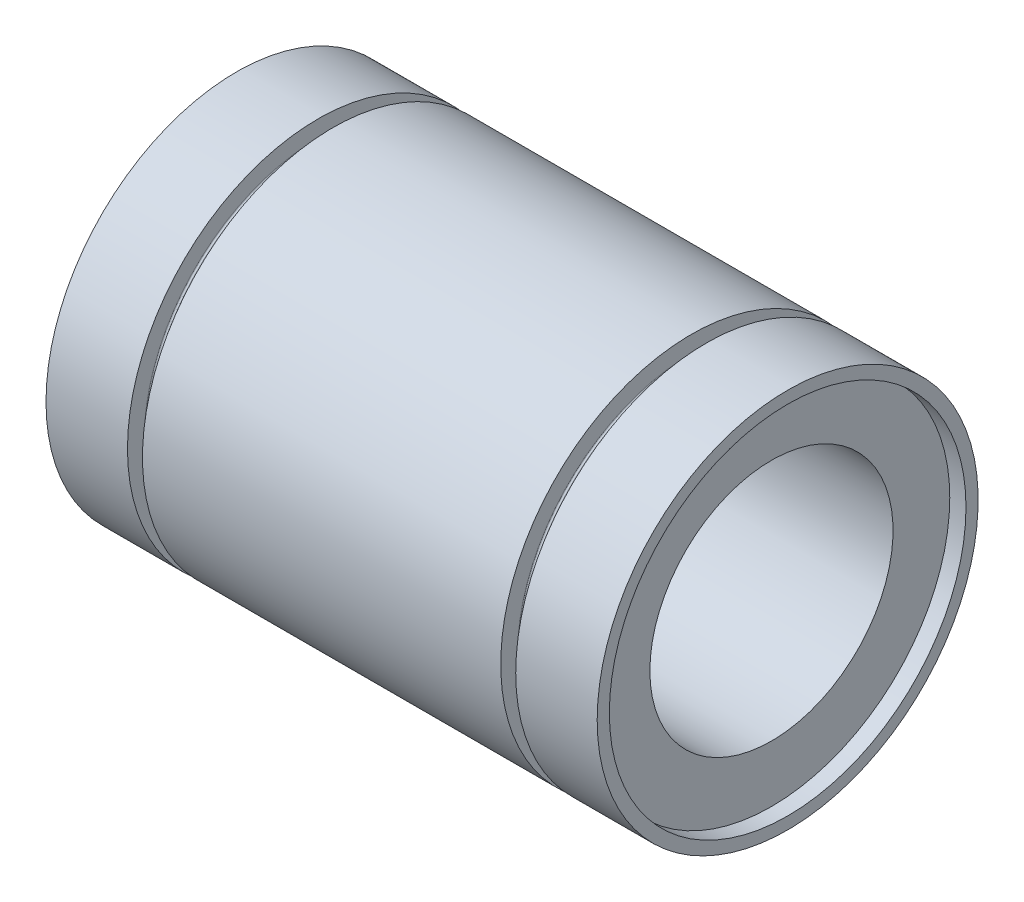
ISO-10303-21;
HEADER;
FILE_DESCRIPTION(('STEP AP214'),'2;1');
FILE_NAME('part.step','',(''),(''),'','','');
FILE_SCHEMA(('AUTOMOTIVE_DESIGN { 1 0 10303 214 1 1 1 1 }'));
ENDSEC;
DATA;
#1=APPLICATION_CONTEXT('core data for automotive mechanical design processes');
#2=APPLICATION_PROTOCOL_DEFINITION('international standard','automotive_design',2000,#1);
#3=PRODUCT_CONTEXT('',#1,'mechanical');
#4=PRODUCT('Part','Part','',(#3));
#5=PRODUCT_RELATED_PRODUCT_CATEGORY('part','',(#4));
#6=PRODUCT_DEFINITION_FORMATION('','',#4);
#7=PRODUCT_DEFINITION_CONTEXT('part definition',#1,'design');
#8=PRODUCT_DEFINITION('design','',#6,#7);
#9=PRODUCT_DEFINITION_SHAPE('','',#8);
#10=(LENGTH_UNIT() NAMED_UNIT(*) SI_UNIT(.MILLI.,.METRE.));
#11=(NAMED_UNIT(*) PLANE_ANGLE_UNIT() SI_UNIT($,.RADIAN.));
#12=(NAMED_UNIT(*) SI_UNIT($,.STERADIAN.) SOLID_ANGLE_UNIT());
#13=UNCERTAINTY_MEASURE_WITH_UNIT(LENGTH_MEASURE(1.E-05),#10,'distance_accuracy_value','');
#14=(GEOMETRIC_REPRESENTATION_CONTEXT(3) GLOBAL_UNCERTAINTY_ASSIGNED_CONTEXT((#13)) GLOBAL_UNIT_ASSIGNED_CONTEXT((#10,
#11,#12)) REPRESENTATION_CONTEXT('',''));
#15=CARTESIAN_POINT('',(0.,0.,0.));
#16=DIRECTION('',(0.,0.,1.));
#17=DIRECTION('',(1.,0.,0.));
#18=AXIS2_PLACEMENT_3D('',#15,#16,#17);
#19=CARTESIAN_POINT('',(0.,0.,0.));
#20=DIRECTION('',(-1.,0.,0.));
#21=DIRECTION('',(0.,0.,1.));
#22=AXIS2_PLACEMENT_3D('',#19,#20,#21);
#23=CYLINDRICAL_SURFACE('',#22,23.5);
#24=CARTESIAN_POINT('',(34.,0.,0.));
#25=DIRECTION('',(-1.,0.,0.));
#26=DIRECTION('',(0.,0.,1.));
#27=AXIS2_PLACEMENT_3D('',#24,#25,#26);
#28=CIRCLE('',#27,23.5);
#29=CARTESIAN_POINT('',(34.,0.,23.5));
#30=VERTEX_POINT('',#29);
#31=EDGE_CURVE('E44',#30,#30,#28,.T.);
#32=ORIENTED_EDGE('',*,*,#31,.T.);
#33=EDGE_LOOP('',(#32));
#34=FACE_BOUND('',#33,.T.);
#35=CARTESIAN_POINT('',(23.95,0.,0.));
#36=DIRECTION('',(-1.,0.,0.));
#37=DIRECTION('',(0.,0.,1.));
#38=AXIS2_PLACEMENT_3D('',#35,#36,#37);
#39=CIRCLE('',#38,23.5);
#40=CARTESIAN_POINT('',(23.95,0.,23.5));
#41=VERTEX_POINT('',#40);
#42=EDGE_CURVE('E40',#41,#41,#39,.F.);
#43=ORIENTED_EDGE('',*,*,#42,.T.);
#44=EDGE_LOOP('',(#43));
#45=FACE_BOUND('',#44,.T.);
#46=ADVANCED_FACE('F36',(#34,#45),#23,.T.);
#47=CARTESIAN_POINT('',(22.1,0.,0.));
#48=DIRECTION('',(1.,0.,0.));
#49=DIRECTION('',(0.,0.,-1.));
#50=AXIS2_PLACEMENT_3D('',#47,#48,#49);
#51=CIRCLE('',#50,23.5);
#52=CARTESIAN_POINT('',(22.1,0.,-23.5));
#53=VERTEX_POINT('',#52);
#54=EDGE_CURVE('E52',#53,#53,#51,.F.);
#55=ORIENTED_EDGE('',*,*,#54,.T.);
#56=EDGE_LOOP('',(#55));
#57=FACE_BOUND('',#56,.T.);
#58=CARTESIAN_POINT('',(-22.1,0.,0.));
#59=DIRECTION('',(1.,0.,0.));
#60=DIRECTION('',(0.,0.,-1.));
#61=AXIS2_PLACEMENT_3D('',#58,#59,#60);
#62=CIRCLE('',#61,23.5);
#63=CARTESIAN_POINT('',(-22.1,0.,-23.5));
#64=VERTEX_POINT('',#63);
#65=EDGE_CURVE('E98',#64,#64,#62,.F.);
#66=ORIENTED_EDGE('',*,*,#65,.F.);
#67=EDGE_LOOP('',(#66));
#68=FACE_BOUND('',#67,.T.);
#69=ADVANCED_FACE('F125',(#57,#68),#23,.T.);
#70=CARTESIAN_POINT('',(0.,0.,0.));
#71=DIRECTION('',(-1.,0.,0.));
#72=DIRECTION('',(0.,0.,1.));
#73=AXIS2_PLACEMENT_3D('',#70,#71,#72);
#74=CYLINDRICAL_SURFACE('',#73,22.);
#75=CARTESIAN_POINT('',(34.,0.,0.));
#76=DIRECTION('',(-1.,0.,0.));
#77=DIRECTION('',(0.,0.,1.));
#78=AXIS2_PLACEMENT_3D('',#75,#76,#77);
#79=CIRCLE('',#78,22.);
#80=CARTESIAN_POINT('',(34.,0.,22.));
#81=VERTEX_POINT('',#80);
#82=EDGE_CURVE('E10',#81,#81,#79,.T.);
#83=ORIENTED_EDGE('',*,*,#82,.F.);
#84=EDGE_LOOP('',(#83));
#85=FACE_BOUND('',#84,.T.);
#86=CARTESIAN_POINT('',(32.,0.,0.));
#87=DIRECTION('',(-1.,0.,0.));
#88=DIRECTION('',(0.,0.,1.));
#89=AXIS2_PLACEMENT_3D('',#86,#87,#88);
#90=CIRCLE('',#89,22.);
#91=CARTESIAN_POINT('',(32.,0.,22.));
#92=VERTEX_POINT('',#91);
#93=EDGE_CURVE('E58',#92,#92,#90,.T.);
#94=ORIENTED_EDGE('',*,*,#93,.T.);
#95=EDGE_LOOP('',(#94));
#96=FACE_BOUND('',#95,.T.);
#97=ADVANCED_FACE('F38',(#85,#96),#74,.F.);
#98=CARTESIAN_POINT('',(34.,0.,0.));
#99=DIRECTION('',(-1.,0.,0.));
#100=DIRECTION('',(0.,0.,1.));
#101=AXIS2_PLACEMENT_3D('',#98,#99,#100);
#102=PLANE('',#101);
#103=ORIENTED_EDGE('',*,*,#31,.F.);
#104=EDGE_LOOP('',(#103));
#105=FACE_BOUND('',#104,.T.);
#106=ORIENTED_EDGE('',*,*,#82,.T.);
#107=EDGE_LOOP('',(#106));
#108=FACE_BOUND('',#107,.T.);
#109=ADVANCED_FACE('F78',(#105,#108),#102,.F.);
#110=CARTESIAN_POINT('',(0.,0.,0.));
#111=DIRECTION('',(-1.,0.,0.));
#112=DIRECTION('',(0.,0.,1.));
#113=AXIS2_PLACEMENT_3D('',#110,#111,#112);
#114=CYLINDRICAL_SURFACE('',#113,15.);
#115=CARTESIAN_POINT('',(32.,0.,0.));
#116=DIRECTION('',(-1.,0.,0.));
#117=DIRECTION('',(0.,0.,1.));
#118=AXIS2_PLACEMENT_3D('',#115,#116,#117);
#119=CIRCLE('',#118,15.);
#120=CARTESIAN_POINT('',(32.,0.,15.));
#121=VERTEX_POINT('',#120);
#122=EDGE_CURVE('E49',#121,#121,#119,.T.);
#123=ORIENTED_EDGE('',*,*,#122,.F.);
#124=EDGE_LOOP('',(#123));
#125=FACE_BOUND('',#124,.T.);
#126=CARTESIAN_POINT('',(-32.,0.,0.));
#127=DIRECTION('',(-1.,0.,0.));
#128=DIRECTION('',(0.,0.,1.));
#129=AXIS2_PLACEMENT_3D('',#126,#127,#128);
#130=CIRCLE('',#129,15.);
#131=CARTESIAN_POINT('',(-32.,0.,15.));
#132=VERTEX_POINT('',#131);
#133=EDGE_CURVE('E82',#132,#132,#130,.T.);
#134=ORIENTED_EDGE('',*,*,#133,.T.);
#135=EDGE_LOOP('',(#134));
#136=FACE_BOUND('',#135,.T.);
#137=ADVANCED_FACE('F75',(#125,#136),#114,.F.);
#138=CARTESIAN_POINT('',(32.,0.,0.));
#139=DIRECTION('',(-1.,0.,0.));
#140=DIRECTION('',(0.,0.,1.));
#141=AXIS2_PLACEMENT_3D('',#138,#139,#140);
#142=PLANE('',#141);
#143=ORIENTED_EDGE('',*,*,#93,.F.);
#144=EDGE_LOOP('',(#143));
#145=FACE_BOUND('',#144,.T.);
#146=ORIENTED_EDGE('',*,*,#122,.T.);
#147=EDGE_LOOP('',(#146));
#148=FACE_BOUND('',#147,.T.);
#149=ADVANCED_FACE('F73',(#145,#148),#142,.F.);
#150=CARTESIAN_POINT('',(23.95,0.,21.435));
#151=DIRECTION('',(-1.,0.,0.));
#152=DIRECTION('',(0.,0.,1.));
#153=AXIS2_PLACEMENT_3D('',#150,#151,#152);
#154=PLANE('',#153);
#155=ORIENTED_EDGE('',*,*,#42,.F.);
#156=EDGE_LOOP('',(#155));
#157=FACE_BOUND('',#156,.T.);
#158=CARTESIAN_POINT('',(23.95,0.,0.));
#159=DIRECTION('',(-1.,0.,0.));
#160=DIRECTION('',(0.,0.,1.));
#161=AXIS2_PLACEMENT_3D('',#158,#159,#160);
#162=CIRCLE('',#161,21.435);
#163=CARTESIAN_POINT('',(23.95,0.,21.435));
#164=VERTEX_POINT('',#163);
#165=EDGE_CURVE('E54',#164,#164,#162,.T.);
#166=ORIENTED_EDGE('',*,*,#165,.F.);
#167=EDGE_LOOP('',(#166));
#168=FACE_BOUND('',#167,.T.);
#169=ADVANCED_FACE('F122',(#157,#168),#154,.T.);
#170=CARTESIAN_POINT('',(23.765,0.,0.));
#171=DIRECTION('',(-1.,0.,0.));
#172=DIRECTION('',(0.,0.,1.));
#173=AXIS2_PLACEMENT_3D('',#170,#171,#172);
#174=TOROIDAL_SURFACE('',#173,21.435,0.185000000000003);
#175=ORIENTED_EDGE('',*,*,#165,.T.);
#176=EDGE_LOOP('',(#175));
#177=FACE_BOUND('',#176,.T.);
#178=CARTESIAN_POINT('',(23.765,0.,0.));
#179=DIRECTION('',(-1.,0.,0.));
#180=DIRECTION('',(0.,0.,1.));
#181=AXIS2_PLACEMENT_3D('',#178,#179,#180);
#182=CIRCLE('',#181,21.25);
#183=CARTESIAN_POINT('',(23.765,0.,21.25));
#184=VERTEX_POINT('',#183);
#185=EDGE_CURVE('E60',#184,#184,#182,.T.);
#186=ORIENTED_EDGE('',*,*,#185,.F.);
#187=EDGE_LOOP('',(#186));
#188=FACE_BOUND('',#187,.T.);
#189=ADVANCED_FACE('F113',(#177,#188),#174,.F.);
#190=CARTESIAN_POINT('',(50.,0.,0.));
#191=DIRECTION('',(-1.,0.,0.));
#192=DIRECTION('',(0.,0.,1.));
#193=AXIS2_PLACEMENT_3D('',#190,#191,#192);
#194=CYLINDRICAL_SURFACE('',#193,21.25);
#195=ORIENTED_EDGE('',*,*,#185,.T.);
#196=EDGE_LOOP('',(#195));
#197=FACE_BOUND('',#196,.T.);
#198=CARTESIAN_POINT('',(22.285,0.,0.));
#199=DIRECTION('',(-1.,0.,0.));
#200=DIRECTION('',(0.,0.,1.));
#201=AXIS2_PLACEMENT_3D('',#198,#199,#200);
#202=CIRCLE('',#201,21.25);
#203=CARTESIAN_POINT('',(22.285,0.,21.25));
#204=VERTEX_POINT('',#203);
#205=EDGE_CURVE('E65',#204,#204,#202,.T.);
#206=ORIENTED_EDGE('',*,*,#205,.F.);
#207=EDGE_LOOP('',(#206));
#208=FACE_BOUND('',#207,.T.);
#209=ADVANCED_FACE('F111',(#197,#208),#194,.T.);
#210=CARTESIAN_POINT('',(22.285,0.,0.));
#211=DIRECTION('',(-1.,0.,0.));
#212=DIRECTION('',(0.,0.,1.));
#213=AXIS2_PLACEMENT_3D('',#210,#211,#212);
#214=TOROIDAL_SURFACE('',#213,21.435,0.184999999999999);
#215=ORIENTED_EDGE('',*,*,#205,.T.);
#216=EDGE_LOOP('',(#215));
#217=FACE_BOUND('',#216,.T.);
#218=CARTESIAN_POINT('',(22.1,0.,0.));
#219=DIRECTION('',(-1.,0.,0.));
#220=DIRECTION('',(0.,0.,1.));
#221=AXIS2_PLACEMENT_3D('',#218,#219,#220);
#222=CIRCLE('',#221,21.435);
#223=CARTESIAN_POINT('',(22.1,0.,21.435));
#224=VERTEX_POINT('',#223);
#225=EDGE_CURVE('E97',#224,#224,#222,.T.);
#226=ORIENTED_EDGE('',*,*,#225,.F.);
#227=EDGE_LOOP('',(#226));
#228=FACE_BOUND('',#227,.T.);
#229=ADVANCED_FACE('F108',(#217,#228),#214,.F.);
#230=CARTESIAN_POINT('',(22.1,0.,28.2));
#231=DIRECTION('',(1.,0.,0.));
#232=DIRECTION('',(0.,0.,-1.));
#233=AXIS2_PLACEMENT_3D('',#230,#231,#232);
#234=PLANE('',#233);
#235=ORIENTED_EDGE('',*,*,#54,.F.);
#236=EDGE_LOOP('',(#235));
#237=FACE_BOUND('',#236,.T.);
#238=ORIENTED_EDGE('',*,*,#225,.T.);
#239=EDGE_LOOP('',(#238));
#240=FACE_BOUND('',#239,.T.);
#241=ADVANCED_FACE('F120',(#237,#240),#234,.T.);
#242=CARTESIAN_POINT('',(0.,0.,0.));
#243=DIRECTION('',(1.,0.,0.));
#244=DIRECTION('',(0.,0.,1.));
#245=AXIS2_PLACEMENT_3D('',#242,#243,#244);
#246=CYLINDRICAL_SURFACE('',#245,23.5);
#247=CARTESIAN_POINT('',(-34.,0.,0.));
#248=DIRECTION('',(-1.,0.,0.));
#249=DIRECTION('',(0.,0.,1.));
#250=AXIS2_PLACEMENT_3D('',#247,#248,#249);
#251=CIRCLE('',#250,23.5);
#252=CARTESIAN_POINT('',(-34.,0.,23.5));
#253=VERTEX_POINT('',#252);
#254=EDGE_CURVE('E84',#253,#253,#251,.T.);
#255=ORIENTED_EDGE('',*,*,#254,.F.);
#256=EDGE_LOOP('',(#255));
#257=FACE_BOUND('',#256,.T.);
#258=CARTESIAN_POINT('',(-23.95,0.,0.));
#259=DIRECTION('',(-1.,0.,0.));
#260=DIRECTION('',(0.,0.,1.));
#261=AXIS2_PLACEMENT_3D('',#258,#259,#260);
#262=CIRCLE('',#261,23.5);
#263=CARTESIAN_POINT('',(-23.95,0.,23.5));
#264=VERTEX_POINT('',#263);
#265=EDGE_CURVE('E91',#264,#264,#262,.F.);
#266=ORIENTED_EDGE('',*,*,#265,.F.);
#267=EDGE_LOOP('',(#266));
#268=FACE_BOUND('',#267,.T.);
#269=ADVANCED_FACE('F196',(#257,#268),#246,.T.);
#270=CARTESIAN_POINT('',(0.,0.,0.));
#271=DIRECTION('',(1.,0.,0.));
#272=DIRECTION('',(0.,0.,1.));
#273=AXIS2_PLACEMENT_3D('',#270,#271,#272);
#274=CYLINDRICAL_SURFACE('',#273,22.);
#275=CARTESIAN_POINT('',(-34.,0.,0.));
#276=DIRECTION('',(-1.,0.,0.));
#277=DIRECTION('',(0.,0.,1.));
#278=AXIS2_PLACEMENT_3D('',#275,#276,#277);
#279=CIRCLE('',#278,22.);
#280=CARTESIAN_POINT('',(-34.,0.,22.));
#281=VERTEX_POINT('',#280);
#282=EDGE_CURVE('E88',#281,#281,#279,.T.);
#283=ORIENTED_EDGE('',*,*,#282,.T.);
#284=EDGE_LOOP('',(#283));
#285=FACE_BOUND('',#284,.T.);
#286=CARTESIAN_POINT('',(-32.,0.,0.));
#287=DIRECTION('',(-1.,0.,0.));
#288=DIRECTION('',(0.,0.,1.));
#289=AXIS2_PLACEMENT_3D('',#286,#287,#288);
#290=CIRCLE('',#289,22.);
#291=CARTESIAN_POINT('',(-32.,0.,22.));
#292=VERTEX_POINT('',#291);
#293=EDGE_CURVE('E85',#292,#292,#290,.T.);
#294=ORIENTED_EDGE('',*,*,#293,.F.);
#295=EDGE_LOOP('',(#294));
#296=FACE_BOUND('',#295,.T.);
#297=ADVANCED_FACE('F215',(#285,#296),#274,.F.);
#298=CARTESIAN_POINT('',(-34.,0.,0.));
#299=DIRECTION('',(1.,0.,0.));
#300=DIRECTION('',(0.,0.,1.));
#301=AXIS2_PLACEMENT_3D('',#298,#299,#300);
#302=PLANE('',#301);
#303=ORIENTED_EDGE('',*,*,#254,.T.);
#304=EDGE_LOOP('',(#303));
#305=FACE_BOUND('',#304,.T.);
#306=ORIENTED_EDGE('',*,*,#282,.F.);
#307=EDGE_LOOP('',(#306));
#308=FACE_BOUND('',#307,.T.);
#309=ADVANCED_FACE('F225',(#305,#308),#302,.F.);
#310=CARTESIAN_POINT('',(-32.,0.,0.));
#311=DIRECTION('',(1.,0.,0.));
#312=DIRECTION('',(0.,0.,1.));
#313=AXIS2_PLACEMENT_3D('',#310,#311,#312);
#314=PLANE('',#313);
#315=ORIENTED_EDGE('',*,*,#293,.T.);
#316=EDGE_LOOP('',(#315));
#317=FACE_BOUND('',#316,.T.);
#318=ORIENTED_EDGE('',*,*,#133,.F.);
#319=EDGE_LOOP('',(#318));
#320=FACE_BOUND('',#319,.T.);
#321=ADVANCED_FACE('F235',(#317,#320),#314,.F.);
#322=CARTESIAN_POINT('',(-23.95,0.,21.435));
#323=DIRECTION('',(1.,0.,0.));
#324=DIRECTION('',(0.,0.,1.));
#325=AXIS2_PLACEMENT_3D('',#322,#323,#324);
#326=PLANE('',#325);
#327=ORIENTED_EDGE('',*,*,#265,.T.);
#328=EDGE_LOOP('',(#327));
#329=FACE_BOUND('',#328,.T.);
#330=CARTESIAN_POINT('',(-23.95,0.,0.));
#331=DIRECTION('',(-1.,0.,0.));
#332=DIRECTION('',(0.,0.,1.));
#333=AXIS2_PLACEMENT_3D('',#330,#331,#332);
#334=CIRCLE('',#333,21.435);
#335=CARTESIAN_POINT('',(-23.95,0.,21.435));
#336=VERTEX_POINT('',#335);
#337=EDGE_CURVE('E101',#336,#336,#334,.T.);
#338=ORIENTED_EDGE('',*,*,#337,.T.);
#339=EDGE_LOOP('',(#338));
#340=FACE_BOUND('',#339,.T.);
#341=ADVANCED_FACE('F245',(#329,#340),#326,.T.);
#342=CARTESIAN_POINT('',(-23.765,0.,0.));
#343=DIRECTION('',(1.,0.,0.));
#344=DIRECTION('',(0.,0.,1.));
#345=AXIS2_PLACEMENT_3D('',#342,#343,#344);
#346=TOROIDAL_SURFACE('',#345,21.435,0.185000000000003);
#347=ORIENTED_EDGE('',*,*,#337,.F.);
#348=EDGE_LOOP('',(#347));
#349=FACE_BOUND('',#348,.T.);
#350=CARTESIAN_POINT('',(-23.765,0.,0.));
#351=DIRECTION('',(-1.,0.,0.));
#352=DIRECTION('',(0.,0.,1.));
#353=AXIS2_PLACEMENT_3D('',#350,#351,#352);
#354=CIRCLE('',#353,21.25);
#355=CARTESIAN_POINT('',(-23.765,0.,21.25));
#356=VERTEX_POINT('',#355);
#357=EDGE_CURVE('E308',#356,#356,#354,.T.);
#358=ORIENTED_EDGE('',*,*,#357,.T.);
#359=EDGE_LOOP('',(#358));
#360=FACE_BOUND('',#359,.T.);
#361=ADVANCED_FACE('F255',(#349,#360),#346,.F.);
#362=CARTESIAN_POINT('',(-50.,0.,0.));
#363=DIRECTION('',(1.,0.,0.));
#364=DIRECTION('',(0.,0.,1.));
#365=AXIS2_PLACEMENT_3D('',#362,#363,#364);
#366=CYLINDRICAL_SURFACE('',#365,21.25);
#367=ORIENTED_EDGE('',*,*,#357,.F.);
#368=EDGE_LOOP('',(#367));
#369=FACE_BOUND('',#368,.T.);
#370=CARTESIAN_POINT('',(-22.285,0.,0.));
#371=DIRECTION('',(-1.,0.,0.));
#372=DIRECTION('',(0.,0.,1.));
#373=AXIS2_PLACEMENT_3D('',#370,#371,#372);
#374=CIRCLE('',#373,21.25);
#375=CARTESIAN_POINT('',(-22.285,0.,21.25));
#376=VERTEX_POINT('',#375);
#377=EDGE_CURVE('E305',#376,#376,#374,.T.);
#378=ORIENTED_EDGE('',*,*,#377,.T.);
#379=EDGE_LOOP('',(#378));
#380=FACE_BOUND('',#379,.T.);
#381=ADVANCED_FACE('F265',(#369,#380),#366,.T.);
#382=CARTESIAN_POINT('',(-22.285,0.,0.));
#383=DIRECTION('',(1.,0.,0.));
#384=DIRECTION('',(0.,0.,1.));
#385=AXIS2_PLACEMENT_3D('',#382,#383,#384);
#386=TOROIDAL_SURFACE('',#385,21.435,0.184999999999999);
#387=ORIENTED_EDGE('',*,*,#377,.F.);
#388=EDGE_LOOP('',(#387));
#389=FACE_BOUND('',#388,.T.);
#390=CARTESIAN_POINT('',(-22.1,0.,0.));
#391=DIRECTION('',(-1.,0.,0.));
#392=DIRECTION('',(0.,0.,1.));
#393=AXIS2_PLACEMENT_3D('',#390,#391,#392);
#394=CIRCLE('',#393,21.435);
#395=CARTESIAN_POINT('',(-22.1,0.,21.435));
#396=VERTEX_POINT('',#395);
#397=EDGE_CURVE('E303',#396,#396,#394,.T.);
#398=ORIENTED_EDGE('',*,*,#397,.T.);
#399=EDGE_LOOP('',(#398));
#400=FACE_BOUND('',#399,.T.);
#401=ADVANCED_FACE('F275',(#389,#400),#386,.F.);
#402=CARTESIAN_POINT('',(-22.1,0.,28.2));
#403=DIRECTION('',(-1.,0.,0.));
#404=DIRECTION('',(0.,0.,-1.));
#405=AXIS2_PLACEMENT_3D('',#402,#403,#404);
#406=PLANE('',#405);
#407=ORIENTED_EDGE('',*,*,#65,.T.);
#408=EDGE_LOOP('',(#407));
#409=FACE_BOUND('',#408,.T.);
#410=ORIENTED_EDGE('',*,*,#397,.F.);
#411=EDGE_LOOP('',(#410));
#412=FACE_BOUND('',#411,.T.);
#413=ADVANCED_FACE('F285',(#409,#412),#406,.T.);
#414=CLOSED_SHELL('',(#46,#69,#97,#109,#137,#149,#169,#189,#209,#229,#241,#269,#297,#309,#321,
#341,#361,#381,#401,#413));
#415=MANIFOLD_SOLID_BREP('B2',#414);
#416=ADVANCED_BREP_SHAPE_REPRESENTATION('',(#18,#415),#14);
#417=SHAPE_DEFINITION_REPRESENTATION(#9,#416);
ENDSEC;
END-ISO-10303-21;
